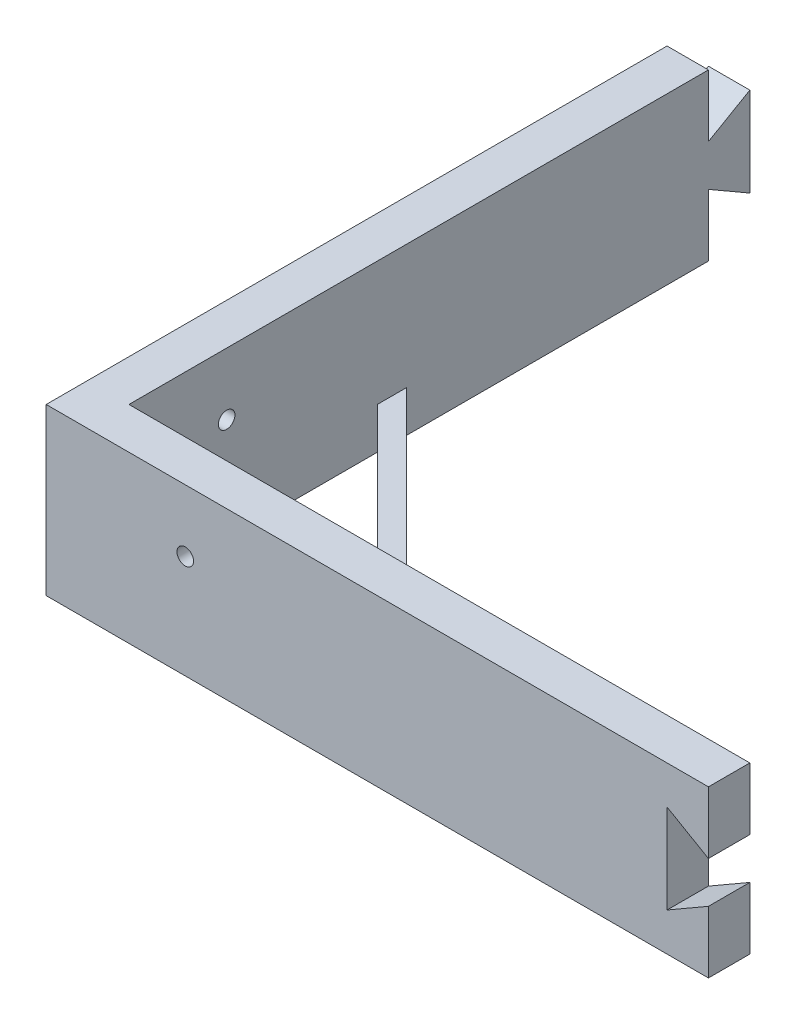
ISO-10303-21;
HEADER;
FILE_DESCRIPTION(('STEP AP214'),'2;1');
FILE_NAME('part.step','',(''),(''),'','','');
FILE_SCHEMA(('AUTOMOTIVE_DESIGN { 1 0 10303 214 1 1 1 1 }'));
ENDSEC;
DATA;
#1=APPLICATION_CONTEXT('core data for automotive mechanical design processes');
#2=APPLICATION_PROTOCOL_DEFINITION('international standard','automotive_design',2000,#1);
#3=PRODUCT_CONTEXT('',#1,'mechanical');
#4=PRODUCT('Part','Part','',(#3));
#5=PRODUCT_RELATED_PRODUCT_CATEGORY('part','',(#4));
#6=PRODUCT_DEFINITION_FORMATION('','',#4);
#7=PRODUCT_DEFINITION_CONTEXT('part definition',#1,'design');
#8=PRODUCT_DEFINITION('design','',#6,#7);
#9=PRODUCT_DEFINITION_SHAPE('','',#8);
#10=(LENGTH_UNIT() NAMED_UNIT(*) SI_UNIT(.MILLI.,.METRE.));
#11=(NAMED_UNIT(*) PLANE_ANGLE_UNIT() SI_UNIT($,.RADIAN.));
#12=(NAMED_UNIT(*) SI_UNIT($,.STERADIAN.) SOLID_ANGLE_UNIT());
#13=UNCERTAINTY_MEASURE_WITH_UNIT(LENGTH_MEASURE(1.E-05),#10,'distance_accuracy_value','');
#14=(GEOMETRIC_REPRESENTATION_CONTEXT(3) GLOBAL_UNCERTAINTY_ASSIGNED_CONTEXT((#13)) GLOBAL_UNIT_ASSIGNED_CONTEXT((#10,
#11,#12)) REPRESENTATION_CONTEXT('',''));
#15=CARTESIAN_POINT('',(0.,0.,0.));
#16=DIRECTION('',(0.,0.,1.));
#17=DIRECTION('',(1.,0.,0.));
#18=AXIS2_PLACEMENT_3D('',#15,#16,#17);
#19=CARTESIAN_POINT('',(6.34999999999999,25.4,203.2));
#20=DIRECTION('',(-1.,0.,0.));
#21=DIRECTION('',(0.,-1.,0.));
#22=AXIS2_PLACEMENT_3D('',#19,#20,#21);
#23=PLANE('',#22);
#24=CARTESIAN_POINT('',(6.35,6.35,160.528));
#25=DIRECTION('',(1.,0.,0.));
#26=DIRECTION('',(0.,1.,0.));
#27=AXIS2_PLACEMENT_3D('',#24,#25,#26);
#28=CIRCLE('',#27,2.53999999999998);
#29=CARTESIAN_POINT('',(6.35,8.88999999999998,160.528));
#30=VERTEX_POINT('',#29);
#31=EDGE_CURVE('E401',#30,#30,#28,.T.);
#32=ORIENTED_EDGE('',*,*,#31,.F.);
#33=EDGE_LOOP('',(#32));
#34=FACE_BOUND('',#33,.T.);
#35=DIRECTION('',(0.,-0.499999999999998,0.86602540378444));
#36=VECTOR('',#35,1.);
#37=CARTESIAN_POINT('',(6.35,10.2617613140312,5.92463065701556));
#38=LINE('',#37,#36);
#39=CARTESIAN_POINT('',(6.35,13.6823484187082,0.));
#40=VERTEX_POINT('',#39);
#41=CARTESIAN_POINT('',(6.35,6.35,12.7));
#42=VERTEX_POINT('',#41);
#43=EDGE_CURVE('E66',#40,#42,#38,.T.);
#44=ORIENTED_EDGE('',*,*,#43,.T.);
#45=DIRECTION('',(0.,-1.,0.));
#46=VECTOR('',#45,1.);
#47=CARTESIAN_POINT('',(6.35,0.,12.7));
#48=LINE('',#47,#46);
#49=CARTESIAN_POINT('',(6.34999999999999,25.4,12.7));
#50=VERTEX_POINT('',#49);
#51=EDGE_CURVE('E301',#50,#42,#48,.T.);
#52=ORIENTED_EDGE('',*,*,#51,.F.);
#53=DIRECTION('',(0.,0.,-1.));
#54=VECTOR('',#53,1.);
#55=CARTESIAN_POINT('',(6.34999999999999,25.4,203.2));
#56=LINE('',#55,#54);
#57=CARTESIAN_POINT('',(6.34999999999999,25.4,190.5));
#58=VERTEX_POINT('',#57);
#59=EDGE_CURVE('E188',#58,#50,#56,.T.);
#60=ORIENTED_EDGE('',*,*,#59,.F.);
#61=DIRECTION('',(0.,1.,0.));
#62=VECTOR('',#61,1.);
#63=CARTESIAN_POINT('',(6.34999999999999,25.4,190.5));
#64=LINE('',#63,#62);
#65=CARTESIAN_POINT('',(6.35,-25.4,190.5));
#66=VERTEX_POINT('',#65);
#67=EDGE_CURVE('E241',#66,#58,#64,.T.);
#68=ORIENTED_EDGE('',*,*,#67,.F.);
#69=DIRECTION('',(0.,0.,-1.));
#70=VECTOR('',#69,1.);
#71=CARTESIAN_POINT('',(6.35,-25.4,203.2));
#72=LINE('',#71,#70);
#73=CARTESIAN_POINT('',(6.35,-25.4,114.300000000001));
#74=VERTEX_POINT('',#73);
#75=EDGE_CURVE('E202',#66,#74,#72,.T.);
#76=ORIENTED_EDGE('',*,*,#75,.T.);
#77=DIRECTION('',(0.,-1.,0.));
#78=VECTOR('',#77,1.);
#79=CARTESIAN_POINT('',(6.34999999999999,-12.7,114.300000000001));
#80=LINE('',#79,#78);
#81=CARTESIAN_POINT('',(6.35,-12.7,114.300000000001));
#82=VERTEX_POINT('',#81);
#83=EDGE_CURVE('E345',#82,#74,#80,.T.);
#84=ORIENTED_EDGE('',*,*,#83,.F.);
#85=DIRECTION('',(0.,0.,-1.));
#86=VECTOR('',#85,1.);
#87=CARTESIAN_POINT('',(6.34999999999999,-12.7,114.300000000001));
#88=LINE('',#87,#86);
#89=CARTESIAN_POINT('',(6.35,-12.7,105.319743878932));
#90=VERTEX_POINT('',#89);
#91=EDGE_CURVE('E335',#82,#90,#88,.T.);
#92=ORIENTED_EDGE('',*,*,#91,.T.);
#93=DIRECTION('',(0.,-1.,0.));
#94=VECTOR('',#93,1.);
#95=CARTESIAN_POINT('',(6.34999999999999,-12.7,105.319743878932));
#96=LINE('',#95,#94);
#97=CARTESIAN_POINT('',(6.34999999999999,-25.4,105.319743878932));
#98=VERTEX_POINT('',#97);
#99=EDGE_CURVE('E281',#90,#98,#96,.T.);
#100=ORIENTED_EDGE('',*,*,#99,.T.);
#101=CARTESIAN_POINT('',(6.35,-25.4,12.7));
#102=VERTEX_POINT('',#101);
#103=EDGE_CURVE('E263',#98,#102,#72,.T.);
#104=ORIENTED_EDGE('',*,*,#103,.T.);
#105=DIRECTION('',(0.,-1.,0.));
#106=VECTOR('',#105,1.);
#107=CARTESIAN_POINT('',(6.35,0.,12.7));
#108=LINE('',#107,#106);
#109=CARTESIAN_POINT('',(6.35,-6.34999999999999,12.7));
#110=VERTEX_POINT('',#109);
#111=EDGE_CURVE('E279',#110,#102,#108,.T.);
#112=ORIENTED_EDGE('',*,*,#111,.F.);
#113=DIRECTION('',(0.,-0.499999999999997,-0.86602540378444));
#114=VECTOR('',#113,1.);
#115=CARTESIAN_POINT('',(6.35,-10.2617613140312,5.92463065701554));
#116=LINE('',#115,#114);
#117=CARTESIAN_POINT('',(6.35,-13.6823484187082,0.));
#118=VERTEX_POINT('',#117);
#119=EDGE_CURVE('E415',#110,#118,#116,.T.);
#120=ORIENTED_EDGE('',*,*,#119,.T.);
#121=DIRECTION('',(0.,1.,0.));
#122=VECTOR('',#121,1.);
#123=CARTESIAN_POINT('',(6.34999999999999,25.4,0.));
#124=LINE('',#123,#122);
#125=EDGE_CURVE('E252',#118,#40,#124,.T.);
#126=ORIENTED_EDGE('',*,*,#125,.T.);
#127=EDGE_LOOP('',(#44,#52,#60,#68,#76,#84,#92,#100,#104,#112,#120,#126));
#128=FACE_BOUND('',#127,.T.);
#129=ADVANCED_FACE('F43',(#34,#128),#23,.F.);
#130=CARTESIAN_POINT('',(-6.35,25.4,203.2));
#131=DIRECTION('',(1.,0.,0.));
#132=DIRECTION('',(0.,1.,0.));
#133=AXIS2_PLACEMENT_3D('',#130,#131,#132);
#134=PLANE('',#133);
#135=CARTESIAN_POINT('',(-6.35000000000002,6.34999999999999,160.528));
#136=DIRECTION('',(1.,0.,0.));
#137=DIRECTION('',(0.,1.,0.));
#138=AXIS2_PLACEMENT_3D('',#135,#136,#137);
#139=CIRCLE('',#138,2.53999999999998);
#140=CARTESIAN_POINT('',(-6.35000000000002,8.88999999999997,160.528));
#141=VERTEX_POINT('',#140);
#142=EDGE_CURVE('E404',#141,#141,#139,.T.);
#143=ORIENTED_EDGE('',*,*,#142,.T.);
#144=EDGE_LOOP('',(#143));
#145=FACE_BOUND('',#144,.T.);
#146=DIRECTION('',(0.,-0.499999999999998,0.86602540378444));
#147=VECTOR('',#146,1.);
#148=CARTESIAN_POINT('',(-6.35000000000001,10.2617613140312,5.92463065701556));
#149=LINE('',#148,#147);
#150=CARTESIAN_POINT('',(-6.35000000000001,13.6823484187082,0.));
#151=VERTEX_POINT('',#150);
#152=CARTESIAN_POINT('',(-6.35000000000001,6.35,12.7));
#153=VERTEX_POINT('',#152);
#154=EDGE_CURVE('E179',#151,#153,#149,.T.);
#155=ORIENTED_EDGE('',*,*,#154,.F.);
#156=DIRECTION('',(0.,-1.,0.));
#157=VECTOR('',#156,1.);
#158=CARTESIAN_POINT('',(-6.35,25.4,0.));
#159=LINE('',#158,#157);
#160=CARTESIAN_POINT('',(-6.35,-13.6823484187082,0.));
#161=VERTEX_POINT('',#160);
#162=EDGE_CURVE('E256',#151,#161,#159,.T.);
#163=ORIENTED_EDGE('',*,*,#162,.T.);
#164=DIRECTION('',(0.,-0.499999999999997,-0.86602540378444));
#165=VECTOR('',#164,1.);
#166=CARTESIAN_POINT('',(-6.35000000000001,-10.2617613140312,5.92463065701554));
#167=LINE('',#166,#165);
#168=CARTESIAN_POINT('',(-6.35000000000001,-6.34999999999999,12.7));
#169=VERTEX_POINT('',#168);
#170=EDGE_CURVE('E58',#169,#161,#167,.T.);
#171=ORIENTED_EDGE('',*,*,#170,.F.);
#172=DIRECTION('',(0.,-1.,0.));
#173=VECTOR('',#172,1.);
#174=CARTESIAN_POINT('',(-6.35000000000001,0.,12.7));
#175=LINE('',#174,#173);
#176=CARTESIAN_POINT('',(-6.35,-25.4,12.7));
#177=VERTEX_POINT('',#176);
#178=EDGE_CURVE('E303',#169,#177,#175,.T.);
#179=ORIENTED_EDGE('',*,*,#178,.T.);
#180=DIRECTION('',(0.,0.,-1.));
#181=VECTOR('',#180,1.);
#182=CARTESIAN_POINT('',(-6.35,-25.4,203.2));
#183=LINE('',#182,#181);
#184=CARTESIAN_POINT('',(-6.35,-25.4,203.2));
#185=VERTEX_POINT('',#184);
#186=EDGE_CURVE('E195',#185,#177,#183,.T.);
#187=ORIENTED_EDGE('',*,*,#186,.F.);
#188=DIRECTION('',(0.,-1.,0.));
#189=VECTOR('',#188,1.);
#190=CARTESIAN_POINT('',(-6.35,25.4,203.2));
#191=LINE('',#190,#189);
#192=CARTESIAN_POINT('',(-6.35,25.4,203.2));
#193=VERTEX_POINT('',#192);
#194=EDGE_CURVE('E193',#193,#185,#191,.T.);
#195=ORIENTED_EDGE('',*,*,#194,.F.);
#196=DIRECTION('',(0.,0.,-1.));
#197=VECTOR('',#196,1.);
#198=CARTESIAN_POINT('',(-6.35,25.4,203.2));
#199=LINE('',#198,#197);
#200=CARTESIAN_POINT('',(-6.35000000000001,25.4,12.7));
#201=VERTEX_POINT('',#200);
#202=EDGE_CURVE('E185',#193,#201,#199,.T.);
#203=ORIENTED_EDGE('',*,*,#202,.T.);
#204=DIRECTION('',(0.,-1.,0.));
#205=VECTOR('',#204,1.);
#206=CARTESIAN_POINT('',(-6.35000000000001,0.,12.7));
#207=LINE('',#206,#205);
#208=EDGE_CURVE('E168',#201,#153,#207,.T.);
#209=ORIENTED_EDGE('',*,*,#208,.T.);
#210=EDGE_LOOP('',(#155,#163,#171,#179,#187,#195,#203,#209));
#211=FACE_BOUND('',#210,.T.);
#212=ADVANCED_FACE('F191',(#145,#211),#134,.F.);
#213=CARTESIAN_POINT('',(0.,0.,0.));
#214=DIRECTION('',(0.,0.,1.));
#215=DIRECTION('',(1.,0.,0.));
#216=AXIS2_PLACEMENT_3D('',#213,#214,#215);
#217=PLANE('',#216);
#218=DIRECTION('',(1.,0.,0.));
#219=VECTOR('',#218,1.);
#220=CARTESIAN_POINT('',(-6.35000000000001,13.6823484187082,0.));
#221=LINE('',#220,#219);
#222=EDGE_CURVE('E312',#151,#40,#221,.T.);
#223=ORIENTED_EDGE('',*,*,#222,.T.);
#224=ORIENTED_EDGE('',*,*,#125,.F.);
#225=DIRECTION('',(1.,0.,0.));
#226=VECTOR('',#225,1.);
#227=CARTESIAN_POINT('',(-6.35000000000001,-13.6823484187082,0.));
#228=LINE('',#227,#226);
#229=EDGE_CURVE('E296',#161,#118,#228,.T.);
#230=ORIENTED_EDGE('',*,*,#229,.F.);
#231=ORIENTED_EDGE('',*,*,#162,.F.);
#232=EDGE_LOOP('',(#223,#224,#230,#231));
#233=FACE_BOUND('',#232,.T.);
#234=ADVANCED_FACE('F396',(#233),#217,.F.);
#235=CARTESIAN_POINT('',(0.,0.,203.2));
#236=DIRECTION('',(0.,0.,1.));
#237=DIRECTION('',(1.,0.,0.));
#238=AXIS2_PLACEMENT_3D('',#235,#236,#237);
#239=PLANE('',#238);
#240=CARTESIAN_POINT('',(36.322,6.35000000000002,203.2));
#241=DIRECTION('',(0.,0.,-1.));
#242=DIRECTION('',(-1.,0.,0.));
#243=AXIS2_PLACEMENT_3D('',#240,#241,#242);
#244=CIRCLE('',#243,2.54);
#245=CARTESIAN_POINT('',(33.782,6.35000000000002,203.2));
#246=VERTEX_POINT('',#245);
#247=EDGE_CURVE('E411',#246,#246,#244,.T.);
#248=ORIENTED_EDGE('',*,*,#247,.T.);
#249=EDGE_LOOP('',(#248));
#250=FACE_BOUND('',#249,.T.);
#251=DIRECTION('',(0.,-1.,0.));
#252=VECTOR('',#251,1.);
#253=CARTESIAN_POINT('',(184.15,0.,203.2));
#254=LINE('',#253,#252);
#255=CARTESIAN_POINT('',(184.15,13.6823484187082,203.2));
#256=VERTEX_POINT('',#255);
#257=CARTESIAN_POINT('',(184.15,-13.6823484187083,203.2));
#258=VERTEX_POINT('',#257);
#259=EDGE_CURVE('E307',#256,#258,#254,.T.);
#260=ORIENTED_EDGE('',*,*,#259,.F.);
#261=DIRECTION('',(0.86602540378444,-0.499999999999998,0.));
#262=VECTOR('',#261,1.);
#263=CARTESIAN_POINT('',(51.9621306570151,90.0010503674831,203.2));
#264=LINE('',#263,#262);
#265=CARTESIAN_POINT('',(196.85,6.35000000000001,203.2));
#266=VERTEX_POINT('',#265);
#267=EDGE_CURVE('E315',#256,#266,#264,.T.);
#268=ORIENTED_EDGE('',*,*,#267,.T.);
#269=DIRECTION('',(0.,-1.,0.));
#270=VECTOR('',#269,1.);
#271=CARTESIAN_POINT('',(196.85,25.4,203.2));
#272=LINE('',#271,#270);
#273=CARTESIAN_POINT('',(196.85,25.4,203.2));
#274=VERTEX_POINT('',#273);
#275=EDGE_CURVE('E217',#274,#266,#272,.T.);
#276=ORIENTED_EDGE('',*,*,#275,.F.);
#277=DIRECTION('',(-1.,0.,0.));
#278=VECTOR('',#277,1.);
#279=CARTESIAN_POINT('',(-6.35,25.4,203.2));
#280=LINE('',#279,#278);
#281=EDGE_CURVE('E253',#274,#193,#280,.T.);
#282=ORIENTED_EDGE('',*,*,#281,.T.);
#283=ORIENTED_EDGE('',*,*,#194,.T.);
#284=DIRECTION('',(1.,0.,0.));
#285=VECTOR('',#284,1.);
#286=CARTESIAN_POINT('',(-6.35,-25.4,203.2));
#287=LINE('',#286,#285);
#288=CARTESIAN_POINT('',(196.85,-25.4,203.2));
#289=VERTEX_POINT('',#288);
#290=EDGE_CURVE('E259',#185,#289,#287,.T.);
#291=ORIENTED_EDGE('',*,*,#290,.T.);
#292=CARTESIAN_POINT('',(196.85,-6.35000000000002,203.2));
#293=VERTEX_POINT('',#292);
#294=EDGE_CURVE('E244',#293,#289,#272,.T.);
#295=ORIENTED_EDGE('',*,*,#294,.F.);
#296=DIRECTION('',(0.866025403784437,0.500000000000004,0.));
#297=VECTOR('',#296,1.);
#298=CARTESIAN_POINT('',(51.9621306570163,-90.0010503674838,203.2));
#299=LINE('',#298,#297);
#300=EDGE_CURVE('E311',#258,#293,#299,.T.);
#301=ORIENTED_EDGE('',*,*,#300,.F.);
#302=EDGE_LOOP('',(#260,#268,#276,#282,#283,#291,#295,#301));
#303=FACE_BOUND('',#302,.T.);
#304=ADVANCED_FACE('F371',(#250,#303),#239,.T.);
#305=CARTESIAN_POINT('',(196.85,25.4,190.5));
#306=DIRECTION('',(0.,0.,1.));
#307=DIRECTION('',(1.,0.,0.));
#308=AXIS2_PLACEMENT_3D('',#305,#306,#307);
#309=PLANE('',#308);
#310=CARTESIAN_POINT('',(36.322,6.35000000000002,190.5));
#311=DIRECTION('',(0.,0.,-1.));
#312=DIRECTION('',(-1.,0.,0.));
#313=AXIS2_PLACEMENT_3D('',#310,#311,#312);
#314=CIRCLE('',#313,2.54);
#315=CARTESIAN_POINT('',(33.782,6.35000000000002,190.5));
#316=VERTEX_POINT('',#315);
#317=EDGE_CURVE('E408',#316,#316,#314,.T.);
#318=ORIENTED_EDGE('',*,*,#317,.F.);
#319=EDGE_LOOP('',(#318));
#320=FACE_BOUND('',#319,.T.);
#321=DIRECTION('',(0.86602540378444,-0.499999999999998,0.));
#322=VECTOR('',#321,1.);
#323=CARTESIAN_POINT('',(188.601108028953,11.1125,190.5));
#324=LINE('',#323,#322);
#325=CARTESIAN_POINT('',(184.15,13.6823484187082,190.5));
#326=VERTEX_POINT('',#325);
#327=CARTESIAN_POINT('',(196.85,6.35000000000001,190.5));
#328=VERTEX_POINT('',#327);
#329=EDGE_CURVE('E224',#326,#328,#324,.T.);
#330=ORIENTED_EDGE('',*,*,#329,.F.);
#331=DIRECTION('',(0.,-1.,0.));
#332=VECTOR('',#331,1.);
#333=CARTESIAN_POINT('',(184.15,25.4,190.5));
#334=LINE('',#333,#332);
#335=CARTESIAN_POINT('',(184.15,-13.6823484187083,190.5));
#336=VERTEX_POINT('',#335);
#337=EDGE_CURVE('E11',#326,#336,#334,.T.);
#338=ORIENTED_EDGE('',*,*,#337,.T.);
#339=DIRECTION('',(0.866025403784437,0.500000000000004,0.));
#340=VECTOR('',#339,1.);
#341=CARTESIAN_POINT('',(210.598153285078,1.58750000000011,190.5));
#342=LINE('',#341,#340);
#343=CARTESIAN_POINT('',(196.85,-6.35000000000001,190.5));
#344=VERTEX_POINT('',#343);
#345=EDGE_CURVE('E322',#336,#344,#342,.T.);
#346=ORIENTED_EDGE('',*,*,#345,.T.);
#347=DIRECTION('',(0.,1.,0.));
#348=VECTOR('',#347,1.);
#349=CARTESIAN_POINT('',(196.85,25.4,190.5));
#350=LINE('',#349,#348);
#351=CARTESIAN_POINT('',(196.85,-25.4,190.5));
#352=VERTEX_POINT('',#351);
#353=EDGE_CURVE('E229',#352,#344,#350,.T.);
#354=ORIENTED_EDGE('',*,*,#353,.F.);
#355=DIRECTION('',(-1.,0.,0.));
#356=VECTOR('',#355,1.);
#357=CARTESIAN_POINT('',(196.85,-25.4,190.5));
#358=LINE('',#357,#356);
#359=CARTESIAN_POINT('',(91.5302561210692,-25.4,190.5));
#360=VERTEX_POINT('',#359);
#361=EDGE_CURVE('E249',#352,#360,#358,.T.);
#362=ORIENTED_EDGE('',*,*,#361,.T.);
#363=DIRECTION('',(0.,-1.,0.));
#364=VECTOR('',#363,1.);
#365=CARTESIAN_POINT('',(91.5302561210692,-12.7,190.5));
#366=LINE('',#365,#364);
#367=CARTESIAN_POINT('',(91.5302561210692,-12.7,190.5));
#368=VERTEX_POINT('',#367);
#369=EDGE_CURVE('E354',#368,#360,#366,.T.);
#370=ORIENTED_EDGE('',*,*,#369,.F.);
#371=DIRECTION('',(-1.,0.,0.));
#372=VECTOR('',#371,1.);
#373=CARTESIAN_POINT('',(82.55,-12.7,190.5));
#374=LINE('',#373,#372);
#375=CARTESIAN_POINT('',(82.55,-12.7,190.5));
#376=VERTEX_POINT('',#375);
#377=EDGE_CURVE('E342',#368,#376,#374,.T.);
#378=ORIENTED_EDGE('',*,*,#377,.T.);
#379=DIRECTION('',(0.,-1.,0.));
#380=VECTOR('',#379,1.);
#381=CARTESIAN_POINT('',(82.55,-12.7,190.5));
#382=LINE('',#381,#380);
#383=CARTESIAN_POINT('',(82.55,-25.4,190.5));
#384=VERTEX_POINT('',#383);
#385=EDGE_CURVE('E245',#376,#384,#382,.T.);
#386=ORIENTED_EDGE('',*,*,#385,.T.);
#387=EDGE_CURVE('E248',#384,#66,#358,.T.);
#388=ORIENTED_EDGE('',*,*,#387,.T.);
#389=ORIENTED_EDGE('',*,*,#67,.T.);
#390=DIRECTION('',(-1.,0.,0.));
#391=VECTOR('',#390,1.);
#392=CARTESIAN_POINT('',(196.85,25.4,190.5));
#393=LINE('',#392,#391);
#394=CARTESIAN_POINT('',(196.85,25.4,190.5));
#395=VERTEX_POINT('',#394);
#396=EDGE_CURVE('E226',#395,#58,#393,.T.);
#397=ORIENTED_EDGE('',*,*,#396,.F.);
#398=EDGE_CURVE('E214',#328,#395,#350,.T.);
#399=ORIENTED_EDGE('',*,*,#398,.F.);
#400=EDGE_LOOP('',(#330,#338,#346,#354,#362,#370,#378,#386,#388,#389,#397,#399));
#401=FACE_BOUND('',#400,.T.);
#402=ADVANCED_FACE('F223',(#320,#401),#309,.F.);
#403=CARTESIAN_POINT('',(196.85,0.,0.));
#404=DIRECTION('',(1.,0.,0.));
#405=DIRECTION('',(0.,1.,0.));
#406=AXIS2_PLACEMENT_3D('',#403,#404,#405);
#407=PLANE('',#406);
#408=ORIENTED_EDGE('',*,*,#275,.T.);
#409=DIRECTION('',(0.,0.,-1.));
#410=VECTOR('',#409,1.);
#411=CARTESIAN_POINT('',(196.85,6.35000000000003,0.));
#412=LINE('',#411,#410);
#413=EDGE_CURVE('E51',#266,#328,#412,.T.);
#414=ORIENTED_EDGE('',*,*,#413,.T.);
#415=ORIENTED_EDGE('',*,*,#398,.T.);
#416=DIRECTION('',(0.,0.,1.));
#417=VECTOR('',#416,1.);
#418=CARTESIAN_POINT('',(196.85,25.4,203.2));
#419=LINE('',#418,#417);
#420=EDGE_CURVE('E235',#395,#274,#419,.T.);
#421=ORIENTED_EDGE('',*,*,#420,.T.);
#422=EDGE_LOOP('',(#408,#414,#415,#421));
#423=FACE_BOUND('',#422,.T.);
#424=ADVANCED_FACE('F212',(#423),#407,.T.);
#425=CARTESIAN_POINT('',(-6.35,25.4,203.2));
#426=DIRECTION('',(0.,-1.,0.));
#427=DIRECTION('',(0.,0.,-1.));
#428=AXIS2_PLACEMENT_3D('',#425,#426,#427);
#429=PLANE('',#428);
#430=ORIENTED_EDGE('',*,*,#59,.T.);
#431=DIRECTION('',(1.,0.,0.));
#432=VECTOR('',#431,1.);
#433=CARTESIAN_POINT('',(-6.35000000000001,25.4,12.7));
#434=LINE('',#433,#432);
#435=EDGE_CURVE('E172',#201,#50,#434,.T.);
#436=ORIENTED_EDGE('',*,*,#435,.F.);
#437=ORIENTED_EDGE('',*,*,#202,.F.);
#438=ORIENTED_EDGE('',*,*,#281,.F.);
#439=ORIENTED_EDGE('',*,*,#420,.F.);
#440=ORIENTED_EDGE('',*,*,#396,.T.);
#441=EDGE_LOOP('',(#430,#436,#437,#438,#439,#440));
#442=FACE_BOUND('',#441,.T.);
#443=ADVANCED_FACE('F184',(#442),#429,.F.);
#444=CARTESIAN_POINT('',(-6.35,-25.4,203.2));
#445=DIRECTION('',(0.,1.,0.));
#446=DIRECTION('',(0.,0.,1.));
#447=AXIS2_PLACEMENT_3D('',#444,#445,#446);
#448=PLANE('',#447);
#449=ORIENTED_EDGE('',*,*,#186,.T.);
#450=DIRECTION('',(1.,0.,0.));
#451=VECTOR('',#450,1.);
#452=CARTESIAN_POINT('',(-6.35,-25.4,12.7));
#453=LINE('',#452,#451);
#454=EDGE_CURVE('E290',#177,#102,#453,.T.);
#455=ORIENTED_EDGE('',*,*,#454,.T.);
#456=ORIENTED_EDGE('',*,*,#103,.F.);
#457=DIRECTION('',(0.707106781186551,0.,0.707106781186544));
#458=VECTOR('',#457,1.);
#459=CARTESIAN_POINT('',(6.34999999999999,-25.4,105.319743878932));
#460=LINE('',#459,#458);
#461=EDGE_CURVE('E289',#98,#360,#460,.T.);
#462=ORIENTED_EDGE('',*,*,#461,.T.);
#463=ORIENTED_EDGE('',*,*,#361,.F.);
#464=DIRECTION('',(0.,0.,-1.));
#465=VECTOR('',#464,1.);
#466=CARTESIAN_POINT('',(196.85,-25.4,203.2));
#467=LINE('',#466,#465);
#468=EDGE_CURVE('E230',#289,#352,#467,.T.);
#469=ORIENTED_EDGE('',*,*,#468,.F.);
#470=ORIENTED_EDGE('',*,*,#290,.F.);
#471=EDGE_LOOP('',(#449,#455,#456,#462,#463,#469,#470));
#472=FACE_BOUND('',#471,.T.);
#473=DIRECTION('',(-0.707106781186551,0.,-0.707106781186544));
#474=VECTOR('',#473,1.);
#475=CARTESIAN_POINT('',(6.34999999999999,-25.4,114.300000000001));
#476=LINE('',#475,#474);
#477=EDGE_CURVE('E330',#384,#74,#476,.T.);
#478=ORIENTED_EDGE('',*,*,#477,.T.);
#479=ORIENTED_EDGE('',*,*,#75,.F.);
#480=ORIENTED_EDGE('',*,*,#387,.F.);
#481=EDGE_LOOP('',(#478,#479,#480));
#482=FACE_BOUND('',#481,.T.);
#483=ADVANCED_FACE('F286',(#472,#482),#448,.F.);
#484=DIRECTION('',(0.,0.,-1.));
#485=VECTOR('',#484,1.);
#486=CARTESIAN_POINT('',(196.85,-6.35000000000003,0.));
#487=LINE('',#486,#485);
#488=EDGE_CURVE('E199',#293,#344,#487,.T.);
#489=ORIENTED_EDGE('',*,*,#488,.F.);
#490=ORIENTED_EDGE('',*,*,#294,.T.);
#491=ORIENTED_EDGE('',*,*,#468,.T.);
#492=ORIENTED_EDGE('',*,*,#353,.T.);
#493=EDGE_LOOP('',(#489,#490,#491,#492));
#494=FACE_BOUND('',#493,.T.);
#495=ADVANCED_FACE('F366',(#494),#407,.T.);
#496=CARTESIAN_POINT('',(6.34999999999999,-12.7,114.300000000001));
#497=DIRECTION('',(-0.707106781186544,0.,0.707106781186551));
#498=DIRECTION('',(0.707106781186551,0.,0.707106781186544));
#499=AXIS2_PLACEMENT_3D('',#496,#497,#498);
#500=PLANE('',#499);
#501=ORIENTED_EDGE('',*,*,#477,.F.);
#502=ORIENTED_EDGE('',*,*,#385,.F.);
#503=DIRECTION('',(-0.707106781186551,0.,-0.707106781186544));
#504=VECTOR('',#503,1.);
#505=CARTESIAN_POINT('',(6.34999999999999,-12.7,114.300000000001));
#506=LINE('',#505,#504);
#507=EDGE_CURVE('E331',#376,#82,#506,.T.);
#508=ORIENTED_EDGE('',*,*,#507,.T.);
#509=ORIENTED_EDGE('',*,*,#83,.T.);
#510=EDGE_LOOP('',(#501,#502,#508,#509));
#511=FACE_BOUND('',#510,.T.);
#512=ADVANCED_FACE('F445',(#511),#500,.T.);
#513=CARTESIAN_POINT('',(6.34999999999999,-12.7,105.319743878932));
#514=DIRECTION('',(0.707106781186543,0.,-0.707106781186551));
#515=DIRECTION('',(-0.707106781186551,0.,-0.707106781186544));
#516=AXIS2_PLACEMENT_3D('',#513,#514,#515);
#517=PLANE('',#516);
#518=ORIENTED_EDGE('',*,*,#461,.F.);
#519=ORIENTED_EDGE('',*,*,#99,.F.);
#520=DIRECTION('',(0.707106781186551,0.,0.707106781186544));
#521=VECTOR('',#520,1.);
#522=CARTESIAN_POINT('',(6.34999999999999,-12.7,105.319743878932));
#523=LINE('',#522,#521);
#524=EDGE_CURVE('E338',#90,#368,#523,.T.);
#525=ORIENTED_EDGE('',*,*,#524,.T.);
#526=ORIENTED_EDGE('',*,*,#369,.T.);
#527=EDGE_LOOP('',(#518,#519,#525,#526));
#528=FACE_BOUND('',#527,.T.);
#529=ADVANCED_FACE('F452',(#528),#517,.T.);
#530=CARTESIAN_POINT('',(0.,-12.7,0.));
#531=DIRECTION('',(0.,1.,0.));
#532=DIRECTION('',(0.,0.,1.));
#533=AXIS2_PLACEMENT_3D('',#530,#531,#532);
#534=PLANE('',#533);
#535=ORIENTED_EDGE('',*,*,#507,.F.);
#536=ORIENTED_EDGE('',*,*,#377,.F.);
#537=ORIENTED_EDGE('',*,*,#524,.F.);
#538=ORIENTED_EDGE('',*,*,#91,.F.);
#539=EDGE_LOOP('',(#535,#536,#537,#538));
#540=FACE_BOUND('',#539,.T.);
#541=ADVANCED_FACE('F388',(#540),#534,.T.);
#542=CARTESIAN_POINT('',(184.15,0.,0.));
#543=DIRECTION('',(-1.,0.,0.));
#544=DIRECTION('',(0.,0.,1.));
#545=AXIS2_PLACEMENT_3D('',#542,#543,#544);
#546=PLANE('',#545);
#547=DIRECTION('',(0.,0.,1.));
#548=VECTOR('',#547,1.);
#549=CARTESIAN_POINT('',(184.15,13.6823484187082,0.));
#550=LINE('',#549,#548);
#551=EDGE_CURVE('E319',#326,#256,#550,.T.);
#552=ORIENTED_EDGE('',*,*,#551,.T.);
#553=ORIENTED_EDGE('',*,*,#259,.T.);
#554=DIRECTION('',(0.,0.,1.));
#555=VECTOR('',#554,1.);
#556=CARTESIAN_POINT('',(184.15,-13.6823484187083,0.));
#557=LINE('',#556,#555);
#558=EDGE_CURVE('E318',#336,#258,#557,.T.);
#559=ORIENTED_EDGE('',*,*,#558,.F.);
#560=ORIENTED_EDGE('',*,*,#337,.F.);
#561=EDGE_LOOP('',(#552,#553,#559,#560));
#562=FACE_BOUND('',#561,.T.);
#563=ADVANCED_FACE('F377',(#562),#546,.F.);
#564=CARTESIAN_POINT('',(51.9621306570151,90.0010503674831,0.));
#565=DIRECTION('',(-0.499999999999998,-0.86602540378444,0.));
#566=DIRECTION('',(0.86602540378444,-0.499999999999998,0.));
#567=AXIS2_PLACEMENT_3D('',#564,#565,#566);
#568=PLANE('',#567);
#569=ORIENTED_EDGE('',*,*,#329,.T.);
#570=ORIENTED_EDGE('',*,*,#413,.F.);
#571=ORIENTED_EDGE('',*,*,#267,.F.);
#572=ORIENTED_EDGE('',*,*,#551,.F.);
#573=EDGE_LOOP('',(#569,#570,#571,#572));
#574=FACE_BOUND('',#573,.T.);
#575=ADVANCED_FACE('F379',(#574),#568,.T.);
#576=CARTESIAN_POINT('',(51.9621306570163,-90.0010503674838,0.));
#577=DIRECTION('',(0.500000000000004,-0.866025403784437,0.));
#578=DIRECTION('',(0.866025403784437,0.500000000000004,0.));
#579=AXIS2_PLACEMENT_3D('',#576,#577,#578);
#580=PLANE('',#579);
#581=ORIENTED_EDGE('',*,*,#558,.T.);
#582=ORIENTED_EDGE('',*,*,#300,.T.);
#583=ORIENTED_EDGE('',*,*,#488,.T.);
#584=ORIENTED_EDGE('',*,*,#345,.F.);
#585=EDGE_LOOP('',(#581,#582,#583,#584));
#586=FACE_BOUND('',#585,.T.);
#587=ADVANCED_FACE('F375',(#586),#580,.F.);
#588=CARTESIAN_POINT('',(-6.35000000000001,-10.2617613140312,5.92463065701554));
#589=DIRECTION('',(0.,-0.86602540378444,0.499999999999997));
#590=DIRECTION('',(0.,-0.499999999999997,-0.86602540378444));
#591=AXIS2_PLACEMENT_3D('',#588,#589,#590);
#592=PLANE('',#591);
#593=ORIENTED_EDGE('',*,*,#119,.F.);
#594=DIRECTION('',(1.,0.,0.));
#595=VECTOR('',#594,1.);
#596=CARTESIAN_POINT('',(-6.35000000000001,-6.34999999999999,12.7));
#597=LINE('',#596,#595);
#598=EDGE_CURVE('E297',#169,#110,#597,.T.);
#599=ORIENTED_EDGE('',*,*,#598,.F.);
#600=ORIENTED_EDGE('',*,*,#170,.T.);
#601=ORIENTED_EDGE('',*,*,#229,.T.);
#602=EDGE_LOOP('',(#593,#599,#600,#601));
#603=FACE_BOUND('',#602,.T.);
#604=ADVANCED_FACE('F386',(#603),#592,.T.);
#605=CARTESIAN_POINT('',(-6.35000000000001,0.,12.7));
#606=DIRECTION('',(0.,0.,1.));
#607=DIRECTION('',(0.,-1.,0.));
#608=AXIS2_PLACEMENT_3D('',#605,#606,#607);
#609=PLANE('',#608);
#610=ORIENTED_EDGE('',*,*,#111,.T.);
#611=ORIENTED_EDGE('',*,*,#454,.F.);
#612=ORIENTED_EDGE('',*,*,#178,.F.);
#613=ORIENTED_EDGE('',*,*,#598,.T.);
#614=EDGE_LOOP('',(#610,#611,#612,#613));
#615=FACE_BOUND('',#614,.T.);
#616=ADVANCED_FACE('F435',(#615),#609,.F.);
#617=CARTESIAN_POINT('',(-6.35000000000001,10.2617613140312,5.92463065701556));
#618=DIRECTION('',(0.,0.86602540378444,0.499999999999998));
#619=DIRECTION('',(0.,-0.499999999999998,0.86602540378444));
#620=AXIS2_PLACEMENT_3D('',#617,#618,#619);
#621=PLANE('',#620);
#622=ORIENTED_EDGE('',*,*,#43,.F.);
#623=ORIENTED_EDGE('',*,*,#222,.F.);
#624=ORIENTED_EDGE('',*,*,#154,.T.);
#625=DIRECTION('',(1.,0.,0.));
#626=VECTOR('',#625,1.);
#627=CARTESIAN_POINT('',(-6.35000000000001,6.35,12.7));
#628=LINE('',#627,#626);
#629=EDGE_CURVE('E174',#153,#42,#628,.T.);
#630=ORIENTED_EDGE('',*,*,#629,.T.);
#631=EDGE_LOOP('',(#622,#623,#624,#630));
#632=FACE_BOUND('',#631,.T.);
#633=ADVANCED_FACE('F440',(#632),#621,.T.);
#634=CARTESIAN_POINT('',(-6.35000000000001,0.,12.7));
#635=DIRECTION('',(0.,0.,1.));
#636=DIRECTION('',(0.,-1.,0.));
#637=AXIS2_PLACEMENT_3D('',#634,#635,#636);
#638=PLANE('',#637);
#639=ORIENTED_EDGE('',*,*,#51,.T.);
#640=ORIENTED_EDGE('',*,*,#629,.F.);
#641=ORIENTED_EDGE('',*,*,#208,.F.);
#642=ORIENTED_EDGE('',*,*,#435,.T.);
#643=EDGE_LOOP('',(#639,#640,#641,#642));
#644=FACE_BOUND('',#643,.T.);
#645=ADVANCED_FACE('F171',(#644),#638,.F.);
#646=CARTESIAN_POINT('',(36.322,6.35000000000002,203.2));
#647=DIRECTION('',(0.,0.,-1.));
#648=DIRECTION('',(-1.,0.,0.));
#649=AXIS2_PLACEMENT_3D('',#646,#647,#648);
#650=CYLINDRICAL_SURFACE('',#649,2.54);
#651=ORIENTED_EDGE('',*,*,#247,.F.);
#652=EDGE_LOOP('',(#651));
#653=FACE_BOUND('',#652,.T.);
#654=ORIENTED_EDGE('',*,*,#317,.T.);
#655=EDGE_LOOP('',(#654));
#656=FACE_BOUND('',#655,.T.);
#657=ADVANCED_FACE('F513',(#653,#656),#650,.F.);
#658=CARTESIAN_POINT('',(-6.35000000000002,6.34999999999999,160.528));
#659=DIRECTION('',(1.,0.,0.));
#660=DIRECTION('',(0.,1.,0.));
#661=AXIS2_PLACEMENT_3D('',#658,#659,#660);
#662=CYLINDRICAL_SURFACE('',#661,2.53999999999998);
#663=ORIENTED_EDGE('',*,*,#142,.F.);
#664=EDGE_LOOP('',(#663));
#665=FACE_BOUND('',#664,.T.);
#666=ORIENTED_EDGE('',*,*,#31,.T.);
#667=EDGE_LOOP('',(#666));
#668=FACE_BOUND('',#667,.T.);
#669=ADVANCED_FACE('F509',(#665,#668),#662,.F.);
#670=CLOSED_SHELL('',(#129,#212,#234,#304,#402,#424,#443,#483,#495,#512,#529,#541,#563,#575,
#587,#604,#616,#633,#645,#657,#669));
#671=MANIFOLD_SOLID_BREP('B2',#670);
#672=ADVANCED_BREP_SHAPE_REPRESENTATION('',(#18,#671),#14);
#673=SHAPE_DEFINITION_REPRESENTATION(#9,#672);
ENDSEC;
END-ISO-10303-21;
